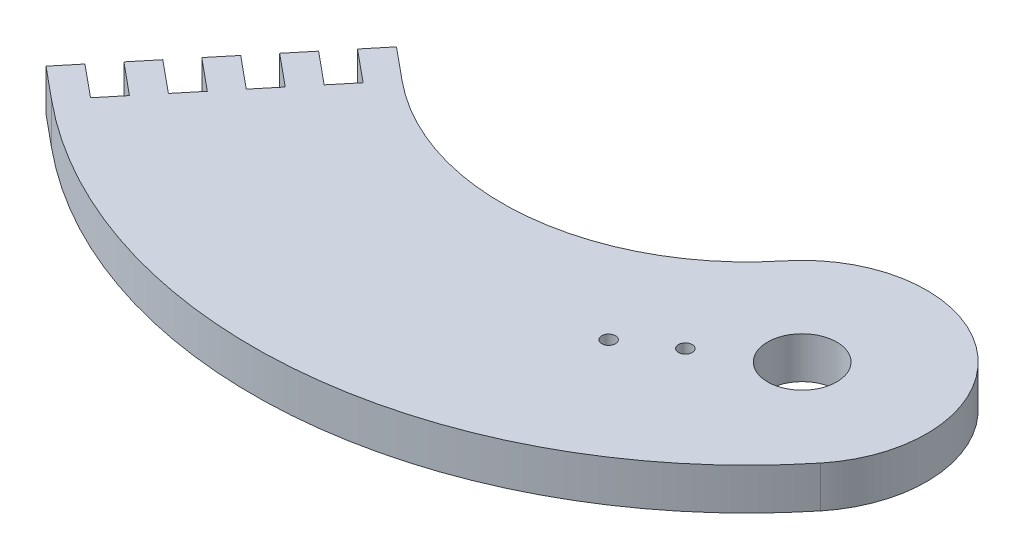
ISO-10303-21;
HEADER;
FILE_DESCRIPTION(('STEP AP214'),'2;1');
FILE_NAME('part.step','',(''),(''),'','','');
FILE_SCHEMA(('AUTOMOTIVE_DESIGN { 1 0 10303 214 1 1 1 1 }'));
ENDSEC;
DATA;
#1=APPLICATION_CONTEXT('core data for automotive mechanical design processes');
#2=APPLICATION_PROTOCOL_DEFINITION('international standard','automotive_design',2000,#1);
#3=PRODUCT_CONTEXT('',#1,'mechanical');
#4=PRODUCT('Part','Part','',(#3));
#5=PRODUCT_RELATED_PRODUCT_CATEGORY('part','',(#4));
#6=PRODUCT_DEFINITION_FORMATION('','',#4);
#7=PRODUCT_DEFINITION_CONTEXT('part definition',#1,'design');
#8=PRODUCT_DEFINITION('design','',#6,#7);
#9=PRODUCT_DEFINITION_SHAPE('','',#8);
#10=(LENGTH_UNIT() NAMED_UNIT(*) SI_UNIT(.MILLI.,.METRE.));
#11=(NAMED_UNIT(*) PLANE_ANGLE_UNIT() SI_UNIT($,.RADIAN.));
#12=(NAMED_UNIT(*) SI_UNIT($,.STERADIAN.) SOLID_ANGLE_UNIT());
#13=UNCERTAINTY_MEASURE_WITH_UNIT(LENGTH_MEASURE(1.E-05),#10,'distance_accuracy_value','');
#14=(GEOMETRIC_REPRESENTATION_CONTEXT(3) GLOBAL_UNCERTAINTY_ASSIGNED_CONTEXT((#13)) GLOBAL_UNIT_ASSIGNED_CONTEXT((#10,
#11,#12)) REPRESENTATION_CONTEXT('',''));
#15=CARTESIAN_POINT('',(0.,0.,0.));
#16=DIRECTION('',(0.,0.,1.));
#17=DIRECTION('',(1.,0.,0.));
#18=AXIS2_PLACEMENT_3D('',#15,#16,#17);
#19=CARTESIAN_POINT('',(-20.7827769161886,3.,-16.8415760441811));
#20=DIRECTION('',(0.,1.,0.));
#21=DIRECTION('',(0.,0.,1.));
#22=AXIS2_PLACEMENT_3D('',#19,#20,#21);
#23=PLANE('',#22);
#24=CARTESIAN_POINT('',(-5.06424038046005,3.,3.38253889392537));
#25=DIRECTION('',(0.,1.,0.));
#26=DIRECTION('',(0.,0.,1.));
#27=AXIS2_PLACEMENT_3D('',#24,#25,#26);
#28=CIRCLE('',#27,0.5);
#29=CARTESIAN_POINT('',(-5.06424038046005,3.,3.88253889392537));
#30=VERTEX_POINT('',#29);
#31=EDGE_CURVE('E416',#30,#30,#28,.T.);
#32=ORIENTED_EDGE('',*,*,#31,.F.);
#33=EDGE_LOOP('',(#32));
#34=FACE_BOUND('',#33,.T.);
#35=CARTESIAN_POINT('',(-20.7827769161886,3.,-16.8415760441811));
#36=DIRECTION('',(0.,-1.,0.));
#37=DIRECTION('',(0.,0.,1.));
#38=AXIS2_PLACEMENT_3D('',#35,#36,#37);
#39=CIRCLE('',#38,17.75);
#40=CARTESIAN_POINT('',(-6.99233615871768,3.,-5.6663246503787));
#41=VERTEX_POINT('',#40);
#42=CARTESIAN_POINT('',(-32.0851133337839,3.,-3.15509762555566));
#43=VERTEX_POINT('',#42);
#44=EDGE_CURVE('E256',#41,#43,#39,.T.);
#45=ORIENTED_EDGE('',*,*,#44,.T.);
#46=DIRECTION('',(-0.771069206683126,0.,-0.636751347470152));
#47=VECTOR('',#46,1.);
#48=CARTESIAN_POINT('',(-34.3983209538332,3.,-5.06535166796612));
#49=LINE('',#48,#47);
#50=CARTESIAN_POINT('',(-34.3983209538332,3.,-5.06535166796612));
#51=VERTEX_POINT('',#50);
#52=EDGE_CURVE('E134',#43,#51,#49,.T.);
#53=ORIENTED_EDGE('',*,*,#52,.T.);
#54=DIRECTION('',(-0.636751347470154,0.,0.771069206683124));
#55=VECTOR('',#54,1.);
#56=CARTESIAN_POINT('',(-34.3983209538332,3.,-5.06535166796612));
#57=LINE('',#56,#55);
#58=CARTESIAN_POINT('',(-35.6718236487735,3.,-3.52321325459987));
#59=VERTEX_POINT('',#58);
#60=EDGE_CURVE('E313',#51,#59,#57,.T.);
#61=ORIENTED_EDGE('',*,*,#60,.T.);
#62=DIRECTION('',(0.771069206683126,0.,0.636751347470153));
#63=VECTOR('',#62,1.);
#64=CARTESIAN_POINT('',(-35.6718236487735,3.,-3.52321325459987));
#65=LINE('',#64,#63);
#66=CARTESIAN_POINT('',(-33.3586160287242,3.,-1.61295921218941));
#67=VERTEX_POINT('',#66);
#68=EDGE_CURVE('E332',#59,#67,#65,.T.);
#69=ORIENTED_EDGE('',*,*,#68,.T.);
#70=DIRECTION('',(-0.636751347470151,0.,0.771069206683127));
#71=VECTOR('',#70,1.);
#72=CARTESIAN_POINT('',(-33.3586160287242,3.,-1.61295921218941));
#73=LINE('',#72,#71);
#74=CARTESIAN_POINT('',(-34.6321187236645,3.,-0.070820798823157));
#75=VERTEX_POINT('',#74);
#76=EDGE_CURVE('E329',#67,#75,#73,.T.);
#77=ORIENTED_EDGE('',*,*,#76,.T.);
#78=DIRECTION('',(-0.771069206683125,0.,-0.636751347470153));
#79=VECTOR('',#78,1.);
#80=CARTESIAN_POINT('',(-36.9453263437139,3.,-1.98107484123362));
#81=LINE('',#80,#79);
#82=CARTESIAN_POINT('',(-36.9453263437139,3.,-1.98107484123362));
#83=VERTEX_POINT('',#82);
#84=EDGE_CURVE('E331',#75,#83,#81,.T.);
#85=ORIENTED_EDGE('',*,*,#84,.T.);
#86=DIRECTION('',(-0.636751347470154,0.,0.771069206683124));
#87=VECTOR('',#86,1.);
#88=CARTESIAN_POINT('',(-36.9453263437139,3.,-1.98107484123362));
#89=LINE('',#88,#87);
#90=CARTESIAN_POINT('',(-38.2188290386542,3.,-0.438936427867368));
#91=VERTEX_POINT('',#90);
#92=EDGE_CURVE('E334',#83,#91,#89,.T.);
#93=ORIENTED_EDGE('',*,*,#92,.T.);
#94=DIRECTION('',(0.771069206683126,0.,0.636751347470152));
#95=VECTOR('',#94,1.);
#96=CARTESIAN_POINT('',(-38.2188290386542,3.,-0.438936427867368));
#97=LINE('',#96,#95);
#98=CARTESIAN_POINT('',(-35.9056214186048,3.,1.47131761454309));
#99=VERTEX_POINT('',#98);
#100=EDGE_CURVE('E340',#91,#99,#97,.T.);
#101=ORIENTED_EDGE('',*,*,#100,.T.);
#102=DIRECTION('',(-0.636751347470152,0.,0.771069206683126));
#103=VECTOR('',#102,1.);
#104=CARTESIAN_POINT('',(-35.9056214186048,3.,1.47131761454309));
#105=LINE('',#104,#103);
#106=CARTESIAN_POINT('',(-37.1791241135451,3.,3.01345602790934));
#107=VERTEX_POINT('',#106);
#108=EDGE_CURVE('E342',#99,#107,#105,.T.);
#109=ORIENTED_EDGE('',*,*,#108,.T.);
#110=DIRECTION('',(-0.771069206683126,0.,-0.636751347470152));
#111=VECTOR('',#110,1.);
#112=CARTESIAN_POINT('',(-39.4923317335945,3.,1.10320198549888));
#113=LINE('',#112,#111);
#114=CARTESIAN_POINT('',(-39.4923317335945,3.,1.10320198549888));
#115=VERTEX_POINT('',#114);
#116=EDGE_CURVE('E344',#107,#115,#113,.T.);
#117=ORIENTED_EDGE('',*,*,#116,.T.);
#118=DIRECTION('',(-0.636751347470154,0.,0.771069206683124));
#119=VECTOR('',#118,1.);
#120=CARTESIAN_POINT('',(-39.4923317335945,3.,1.10320198549888));
#121=LINE('',#120,#119);
#122=CARTESIAN_POINT('',(-40.7658344285348,3.,2.64534039886513));
#123=VERTEX_POINT('',#122);
#124=EDGE_CURVE('E346',#115,#123,#121,.T.);
#125=ORIENTED_EDGE('',*,*,#124,.T.);
#126=DIRECTION('',(0.771069206683126,0.,0.636751347470152));
#127=VECTOR('',#126,1.);
#128=CARTESIAN_POINT('',(-40.7658344285348,3.,2.64534039886513));
#129=LINE('',#128,#127);
#130=CARTESIAN_POINT('',(-38.4526268084854,3.,4.55559444127559));
#131=VERTEX_POINT('',#130);
#132=EDGE_CURVE('E348',#123,#131,#129,.T.);
#133=ORIENTED_EDGE('',*,*,#132,.T.);
#134=DIRECTION('',(-0.636751347470152,0.,0.771069206683126));
#135=VECTOR('',#134,1.);
#136=CARTESIAN_POINT('',(-38.4526268084854,3.,4.55559444127559));
#137=LINE('',#136,#135);
#138=CARTESIAN_POINT('',(-39.7261295034257,3.,6.09773285464184));
#139=VERTEX_POINT('',#138);
#140=EDGE_CURVE('E350',#131,#139,#137,.T.);
#141=ORIENTED_EDGE('',*,*,#140,.T.);
#142=DIRECTION('',(-0.771069206683126,0.,-0.636751347470152));
#143=VECTOR('',#142,1.);
#144=CARTESIAN_POINT('',(-42.0393371234751,3.,4.18747881223138));
#145=LINE('',#144,#143);
#146=CARTESIAN_POINT('',(-42.0393371234751,3.,4.18747881223138));
#147=VERTEX_POINT('',#146);
#148=EDGE_CURVE('E352',#139,#147,#145,.T.);
#149=ORIENTED_EDGE('',*,*,#148,.T.);
#150=DIRECTION('',(-0.636751347470154,0.,0.771069206683124));
#151=VECTOR('',#150,1.);
#152=CARTESIAN_POINT('',(-42.0393371234751,3.,4.18747881223138));
#153=LINE('',#152,#151);
#154=CARTESIAN_POINT('',(-43.3128398184154,3.,5.72961722559763));
#155=VERTEX_POINT('',#154);
#156=EDGE_CURVE('E354',#147,#155,#153,.T.);
#157=ORIENTED_EDGE('',*,*,#156,.T.);
#158=DIRECTION('',(0.771069206683126,0.,0.636751347470152));
#159=VECTOR('',#158,1.);
#160=CARTESIAN_POINT('',(-43.3128398184154,3.,5.72961722559763));
#161=LINE('',#160,#159);
#162=CARTESIAN_POINT('',(-40.999632198366,3.,7.63987126800809));
#163=VERTEX_POINT('',#162);
#164=EDGE_CURVE('E356',#155,#163,#161,.T.);
#165=ORIENTED_EDGE('',*,*,#164,.T.);
#166=DIRECTION('',(-0.636751347470147,0.,0.771069206683131));
#167=VECTOR('',#166,1.);
#168=CARTESIAN_POINT('',(-40.999632198366,3.,7.63987126800809));
#169=LINE('',#168,#167);
#170=CARTESIAN_POINT('',(-42.2731348933063,3.,9.18200968137435));
#171=VERTEX_POINT('',#170);
#172=EDGE_CURVE('E358',#163,#171,#169,.T.);
#173=ORIENTED_EDGE('',*,*,#172,.T.);
#174=DIRECTION('',(-0.771069206683126,0.,-0.636751347470153));
#175=VECTOR('',#174,1.);
#176=CARTESIAN_POINT('',(-44.5863425133557,3.,7.27175563896388));
#177=LINE('',#176,#175);
#178=CARTESIAN_POINT('',(-44.5863425133557,3.,7.27175563896388));
#179=VERTEX_POINT('',#178);
#180=EDGE_CURVE('E360',#171,#179,#177,.T.);
#181=ORIENTED_EDGE('',*,*,#180,.T.);
#182=DIRECTION('',(-0.636751347470145,0.,0.771069206683133));
#183=VECTOR('',#182,1.);
#184=CARTESIAN_POINT('',(-44.5863425133557,3.,7.27175563896388));
#185=LINE('',#184,#183);
#186=CARTESIAN_POINT('',(-45.859845208296,3.,8.81389405233015));
#187=VERTEX_POINT('',#186);
#188=EDGE_CURVE('E195',#179,#187,#185,.T.);
#189=ORIENTED_EDGE('',*,*,#188,.T.);
#190=DIRECTION('',(0.771069206683126,0.,0.636751347470152));
#191=VECTOR('',#190,1.);
#192=CARTESIAN_POINT('',(-45.859845208296,3.,8.81389405233015));
#193=LINE('',#192,#191);
#194=CARTESIAN_POINT('',(-43.5466375882466,3.,10.7241480947406));
#195=VERTEX_POINT('',#194);
#196=EDGE_CURVE('E189',#187,#195,#193,.T.);
#197=ORIENTED_EDGE('',*,*,#196,.T.);
#198=CARTESIAN_POINT('',(-20.7827769161886,3.,-16.8415760441811));
#199=DIRECTION('',(0.,1.,0.));
#200=DIRECTION('',(0.,0.,1.));
#201=AXIS2_PLACEMENT_3D('',#198,#199,#200);
#202=CIRCLE('',#201,35.75);
#203=CARTESIAN_POINT('',(6.99233615871769,3.,5.6663246503787));
#204=VERTEX_POINT('',#203);
#205=EDGE_CURVE('E193',#195,#204,#202,.T.);
#206=ORIENTED_EDGE('',*,*,#205,.T.);
#207=CARTESIAN_POINT('',(0.,3.,0.));
#208=DIRECTION('',(0.,1.,0.));
#209=DIRECTION('',(0.,0.,1.));
#210=AXIS2_PLACEMENT_3D('',#207,#208,#209);
#211=CIRCLE('',#210,9.);
#212=EDGE_CURVE('E49',#204,#41,#211,.T.);
#213=ORIENTED_EDGE('',*,*,#212,.T.);
#214=EDGE_LOOP('',(#45,#53,#61,#69,#77,#85,#93,#101,#109,#117,#125,#133,#141,#149,#157,#165,
#173,#181,#189,#197,#206,#213));
#215=FACE_BOUND('',#214,.T.);
#216=CARTESIAN_POINT('',(0.,3.,0.));
#217=DIRECTION('',(0.,1.,0.));
#218=DIRECTION('',(0.,0.,1.));
#219=AXIS2_PLACEMENT_3D('',#216,#217,#218);
#220=CIRCLE('',#219,2.5);
#221=CARTESIAN_POINT('',(0.,3.,2.5));
#222=VERTEX_POINT('',#221);
#223=EDGE_CURVE('E217',#222,#222,#220,.T.);
#224=ORIENTED_EDGE('',*,*,#223,.F.);
#225=EDGE_LOOP('',(#224));
#226=FACE_BOUND('',#225,.T.);
#227=CARTESIAN_POINT('',(-8.39050664020392,3.,5.60423931686486));
#228=DIRECTION('',(0.,1.,0.));
#229=DIRECTION('',(0.,0.,1.));
#230=AXIS2_PLACEMENT_3D('',#227,#228,#229);
#231=CIRCLE('',#230,0.500000000000001);
#232=CARTESIAN_POINT('',(-8.39050664020392,3.,6.10423931686486));
#233=VERTEX_POINT('',#232);
#234=EDGE_CURVE('E407',#233,#233,#231,.T.);
#235=ORIENTED_EDGE('',*,*,#234,.F.);
#236=EDGE_LOOP('',(#235));
#237=FACE_BOUND('',#236,.T.);
#238=ADVANCED_FACE('F32',(#34,#215,#226,#237),#23,.T.);
#239=CARTESIAN_POINT('',(-20.7827769161886,0.,-16.8415760441811));
#240=DIRECTION('',(0.,1.,0.));
#241=DIRECTION('',(0.,0.,1.));
#242=AXIS2_PLACEMENT_3D('',#239,#240,#241);
#243=PLANE('',#242);
#244=CARTESIAN_POINT('',(-5.06424038046005,0.,3.38253889392537));
#245=DIRECTION('',(0.,1.,0.));
#246=DIRECTION('',(0.,0.,1.));
#247=AXIS2_PLACEMENT_3D('',#244,#245,#246);
#248=CIRCLE('',#247,0.5);
#249=CARTESIAN_POINT('',(-5.06424038046005,0.,3.88253889392537));
#250=VERTEX_POINT('',#249);
#251=EDGE_CURVE('E413',#250,#250,#248,.T.);
#252=ORIENTED_EDGE('',*,*,#251,.T.);
#253=EDGE_LOOP('',(#252));
#254=FACE_BOUND('',#253,.T.);
#255=CARTESIAN_POINT('',(-20.7827769161886,0.,-16.8415760441811));
#256=DIRECTION('',(0.,-1.,0.));
#257=DIRECTION('',(0.,0.,1.));
#258=AXIS2_PLACEMENT_3D('',#255,#256,#257);
#259=CIRCLE('',#258,17.75);
#260=CARTESIAN_POINT('',(-6.99233615871768,0.,-5.6663246503787));
#261=VERTEX_POINT('',#260);
#262=CARTESIAN_POINT('',(-32.0851133337839,0.,-3.15509762555566));
#263=VERTEX_POINT('',#262);
#264=EDGE_CURVE('E213',#261,#263,#259,.T.);
#265=ORIENTED_EDGE('',*,*,#264,.F.);
#266=CARTESIAN_POINT('',(0.,0.,0.));
#267=DIRECTION('',(0.,1.,0.));
#268=DIRECTION('',(0.,0.,1.));
#269=AXIS2_PLACEMENT_3D('',#266,#267,#268);
#270=CIRCLE('',#269,9.);
#271=CARTESIAN_POINT('',(6.99233615871769,0.,5.6663246503787));
#272=VERTEX_POINT('',#271);
#273=EDGE_CURVE('E126',#272,#261,#270,.T.);
#274=ORIENTED_EDGE('',*,*,#273,.F.);
#275=CARTESIAN_POINT('',(-20.7827769161886,0.,-16.8415760441811));
#276=DIRECTION('',(0.,1.,0.));
#277=DIRECTION('',(0.,0.,1.));
#278=AXIS2_PLACEMENT_3D('',#275,#276,#277);
#279=CIRCLE('',#278,35.75);
#280=CARTESIAN_POINT('',(-43.5466375882466,0.,10.7241480947406));
#281=VERTEX_POINT('',#280);
#282=EDGE_CURVE('E120',#281,#272,#279,.T.);
#283=ORIENTED_EDGE('',*,*,#282,.F.);
#284=DIRECTION('',(0.771069206683126,0.,0.636751347470152));
#285=VECTOR('',#284,1.);
#286=CARTESIAN_POINT('',(-45.859845208296,0.,8.81389405233015));
#287=LINE('',#286,#285);
#288=CARTESIAN_POINT('',(-45.859845208296,0.,8.81389405233015));
#289=VERTEX_POINT('',#288);
#290=EDGE_CURVE('E203',#289,#281,#287,.T.);
#291=ORIENTED_EDGE('',*,*,#290,.F.);
#292=DIRECTION('',(-0.636751347470145,0.,0.771069206683133));
#293=VECTOR('',#292,1.);
#294=CARTESIAN_POINT('',(-44.5863425133557,0.,7.27175563896388));
#295=LINE('',#294,#293);
#296=CARTESIAN_POINT('',(-44.5863425133557,0.,7.27175563896388));
#297=VERTEX_POINT('',#296);
#298=EDGE_CURVE('E251',#297,#289,#295,.T.);
#299=ORIENTED_EDGE('',*,*,#298,.F.);
#300=DIRECTION('',(-0.771069206683126,0.,-0.636751347470153));
#301=VECTOR('',#300,1.);
#302=CARTESIAN_POINT('',(-44.5863425133557,0.,7.27175563896388));
#303=LINE('',#302,#301);
#304=CARTESIAN_POINT('',(-42.2731348933063,0.,9.18200968137435));
#305=VERTEX_POINT('',#304);
#306=EDGE_CURVE('E249',#305,#297,#303,.T.);
#307=ORIENTED_EDGE('',*,*,#306,.F.);
#308=DIRECTION('',(-0.636751347470147,0.,0.771069206683131));
#309=VECTOR('',#308,1.);
#310=CARTESIAN_POINT('',(-40.999632198366,0.,7.63987126800809));
#311=LINE('',#310,#309);
#312=CARTESIAN_POINT('',(-40.999632198366,0.,7.63987126800809));
#313=VERTEX_POINT('',#312);
#314=EDGE_CURVE('E247',#313,#305,#311,.T.);
#315=ORIENTED_EDGE('',*,*,#314,.F.);
#316=DIRECTION('',(0.771069206683126,0.,0.636751347470152));
#317=VECTOR('',#316,1.);
#318=CARTESIAN_POINT('',(-43.3128398184154,0.,5.72961722559763));
#319=LINE('',#318,#317);
#320=CARTESIAN_POINT('',(-43.3128398184154,0.,5.72961722559763));
#321=VERTEX_POINT('',#320);
#322=EDGE_CURVE('E245',#321,#313,#319,.T.);
#323=ORIENTED_EDGE('',*,*,#322,.F.);
#324=DIRECTION('',(-0.636751347470154,0.,0.771069206683124));
#325=VECTOR('',#324,1.);
#326=CARTESIAN_POINT('',(-42.0393371234751,0.,4.18747881223138));
#327=LINE('',#326,#325);
#328=CARTESIAN_POINT('',(-42.0393371234751,0.,4.18747881223138));
#329=VERTEX_POINT('',#328);
#330=EDGE_CURVE('E243',#329,#321,#327,.T.);
#331=ORIENTED_EDGE('',*,*,#330,.F.);
#332=DIRECTION('',(-0.771069206683126,0.,-0.636751347470152));
#333=VECTOR('',#332,1.);
#334=CARTESIAN_POINT('',(-42.0393371234751,0.,4.18747881223138));
#335=LINE('',#334,#333);
#336=CARTESIAN_POINT('',(-39.7261295034257,0.,6.09773285464184));
#337=VERTEX_POINT('',#336);
#338=EDGE_CURVE('E241',#337,#329,#335,.T.);
#339=ORIENTED_EDGE('',*,*,#338,.F.);
#340=DIRECTION('',(-0.636751347470152,0.,0.771069206683126));
#341=VECTOR('',#340,1.);
#342=CARTESIAN_POINT('',(-38.4526268084854,0.,4.55559444127559));
#343=LINE('',#342,#341);
#344=CARTESIAN_POINT('',(-38.4526268084854,0.,4.55559444127559));
#345=VERTEX_POINT('',#344);
#346=EDGE_CURVE('E239',#345,#337,#343,.T.);
#347=ORIENTED_EDGE('',*,*,#346,.F.);
#348=DIRECTION('',(0.771069206683126,0.,0.636751347470152));
#349=VECTOR('',#348,1.);
#350=CARTESIAN_POINT('',(-40.7658344285348,0.,2.64534039886513));
#351=LINE('',#350,#349);
#352=CARTESIAN_POINT('',(-40.7658344285348,0.,2.64534039886513));
#353=VERTEX_POINT('',#352);
#354=EDGE_CURVE('E237',#353,#345,#351,.T.);
#355=ORIENTED_EDGE('',*,*,#354,.F.);
#356=DIRECTION('',(-0.636751347470154,0.,0.771069206683124));
#357=VECTOR('',#356,1.);
#358=CARTESIAN_POINT('',(-39.4923317335945,0.,1.10320198549888));
#359=LINE('',#358,#357);
#360=CARTESIAN_POINT('',(-39.4923317335945,0.,1.10320198549888));
#361=VERTEX_POINT('',#360);
#362=EDGE_CURVE('E235',#361,#353,#359,.T.);
#363=ORIENTED_EDGE('',*,*,#362,.F.);
#364=DIRECTION('',(-0.771069206683126,0.,-0.636751347470152));
#365=VECTOR('',#364,1.);
#366=CARTESIAN_POINT('',(-39.4923317335945,0.,1.10320198549888));
#367=LINE('',#366,#365);
#368=CARTESIAN_POINT('',(-37.1791241135451,0.,3.01345602790934));
#369=VERTEX_POINT('',#368);
#370=EDGE_CURVE('E233',#369,#361,#367,.T.);
#371=ORIENTED_EDGE('',*,*,#370,.F.);
#372=DIRECTION('',(-0.636751347470152,0.,0.771069206683126));
#373=VECTOR('',#372,1.);
#374=CARTESIAN_POINT('',(-35.9056214186048,0.,1.47131761454309));
#375=LINE('',#374,#373);
#376=CARTESIAN_POINT('',(-35.9056214186048,0.,1.47131761454309));
#377=VERTEX_POINT('',#376);
#378=EDGE_CURVE('E231',#377,#369,#375,.T.);
#379=ORIENTED_EDGE('',*,*,#378,.F.);
#380=DIRECTION('',(0.771069206683126,0.,0.636751347470152));
#381=VECTOR('',#380,1.);
#382=CARTESIAN_POINT('',(-38.2188290386542,0.,-0.438936427867368));
#383=LINE('',#382,#381);
#384=CARTESIAN_POINT('',(-38.2188290386542,0.,-0.438936427867368));
#385=VERTEX_POINT('',#384);
#386=EDGE_CURVE('E229',#385,#377,#383,.T.);
#387=ORIENTED_EDGE('',*,*,#386,.F.);
#388=DIRECTION('',(-0.636751347470154,0.,0.771069206683124));
#389=VECTOR('',#388,1.);
#390=CARTESIAN_POINT('',(-36.9453263437139,0.,-1.98107484123362));
#391=LINE('',#390,#389);
#392=CARTESIAN_POINT('',(-36.9453263437139,0.,-1.98107484123362));
#393=VERTEX_POINT('',#392);
#394=EDGE_CURVE('E227',#393,#385,#391,.T.);
#395=ORIENTED_EDGE('',*,*,#394,.F.);
#396=DIRECTION('',(-0.771069206683125,0.,-0.636751347470153));
#397=VECTOR('',#396,1.);
#398=CARTESIAN_POINT('',(-36.9453263437139,0.,-1.98107484123362));
#399=LINE('',#398,#397);
#400=CARTESIAN_POINT('',(-34.6321187236645,0.,-0.070820798823157));
#401=VERTEX_POINT('',#400);
#402=EDGE_CURVE('E225',#401,#393,#399,.T.);
#403=ORIENTED_EDGE('',*,*,#402,.F.);
#404=DIRECTION('',(-0.636751347470151,0.,0.771069206683127));
#405=VECTOR('',#404,1.);
#406=CARTESIAN_POINT('',(-33.3586160287242,0.,-1.61295921218941));
#407=LINE('',#406,#405);
#408=CARTESIAN_POINT('',(-33.3586160287242,0.,-1.61295921218941));
#409=VERTEX_POINT('',#408);
#410=EDGE_CURVE('E223',#409,#401,#407,.T.);
#411=ORIENTED_EDGE('',*,*,#410,.F.);
#412=DIRECTION('',(0.771069206683126,0.,0.636751347470153));
#413=VECTOR('',#412,1.);
#414=CARTESIAN_POINT('',(-35.6718236487735,0.,-3.52321325459987));
#415=LINE('',#414,#413);
#416=CARTESIAN_POINT('',(-35.6718236487735,0.,-3.52321325459987));
#417=VERTEX_POINT('',#416);
#418=EDGE_CURVE('E221',#417,#409,#415,.T.);
#419=ORIENTED_EDGE('',*,*,#418,.F.);
#420=DIRECTION('',(-0.636751347470154,0.,0.771069206683124));
#421=VECTOR('',#420,1.);
#422=CARTESIAN_POINT('',(-34.3983209538332,0.,-5.06535166796612));
#423=LINE('',#422,#421);
#424=CARTESIAN_POINT('',(-34.3983209538332,0.,-5.06535166796612));
#425=VERTEX_POINT('',#424);
#426=EDGE_CURVE('E219',#425,#417,#423,.T.);
#427=ORIENTED_EDGE('',*,*,#426,.F.);
#428=DIRECTION('',(-0.771069206683126,0.,-0.636751347470152));
#429=VECTOR('',#428,1.);
#430=CARTESIAN_POINT('',(-34.3983209538332,0.,-5.06535166796612));
#431=LINE('',#430,#429);
#432=EDGE_CURVE('E216',#263,#425,#431,.T.);
#433=ORIENTED_EDGE('',*,*,#432,.F.);
#434=EDGE_LOOP('',(#265,#274,#283,#291,#299,#307,#315,#323,#331,#339,#347,#355,#363,#371,#379,
#387,#395,#403,#411,#419,#427,#433));
#435=FACE_BOUND('',#434,.T.);
#436=CARTESIAN_POINT('',(0.,0.,0.));
#437=DIRECTION('',(0.,1.,0.));
#438=DIRECTION('',(0.,0.,1.));
#439=AXIS2_PLACEMENT_3D('',#436,#437,#438);
#440=CIRCLE('',#439,2.5);
#441=CARTESIAN_POINT('',(0.,0.,2.5));
#442=VERTEX_POINT('',#441);
#443=EDGE_CURVE('E419',#442,#442,#440,.T.);
#444=ORIENTED_EDGE('',*,*,#443,.T.);
#445=EDGE_LOOP('',(#444));
#446=FACE_BOUND('',#445,.T.);
#447=CARTESIAN_POINT('',(-8.39050664020392,0.,5.60423931686486));
#448=DIRECTION('',(0.,1.,0.));
#449=DIRECTION('',(0.,0.,1.));
#450=AXIS2_PLACEMENT_3D('',#447,#448,#449);
#451=CIRCLE('',#450,0.500000000000001);
#452=CARTESIAN_POINT('',(-8.39050664020392,0.,6.10423931686486));
#453=VERTEX_POINT('',#452);
#454=EDGE_CURVE('E410',#453,#453,#451,.T.);
#455=ORIENTED_EDGE('',*,*,#454,.T.);
#456=EDGE_LOOP('',(#455));
#457=FACE_BOUND('',#456,.T.);
#458=ADVANCED_FACE('F317',(#254,#435,#446,#457),#243,.F.);
#459=CARTESIAN_POINT('',(-20.7827769161886,3.,-16.8415760441811));
#460=DIRECTION('',(0.,-1.,0.));
#461=DIRECTION('',(0.,0.,-1.));
#462=AXIS2_PLACEMENT_3D('',#459,#460,#461);
#463=CYLINDRICAL_SURFACE('',#462,17.75);
#464=ORIENTED_EDGE('',*,*,#264,.T.);
#465=DIRECTION('',(0.,-1.,0.));
#466=VECTOR('',#465,1.);
#467=CARTESIAN_POINT('',(-32.0851133337839,3.,-3.15509762555566));
#468=LINE('',#467,#466);
#469=EDGE_CURVE('E11',#43,#263,#468,.T.);
#470=ORIENTED_EDGE('',*,*,#469,.F.);
#471=ORIENTED_EDGE('',*,*,#44,.F.);
#472=DIRECTION('',(0.,-1.,0.));
#473=VECTOR('',#472,1.);
#474=CARTESIAN_POINT('',(-6.99233615871768,3.,-5.6663246503787));
#475=LINE('',#474,#473);
#476=EDGE_CURVE('E209',#41,#261,#475,.T.);
#477=ORIENTED_EDGE('',*,*,#476,.T.);
#478=EDGE_LOOP('',(#464,#470,#471,#477));
#479=FACE_BOUND('',#478,.T.);
#480=ADVANCED_FACE('F34',(#479),#463,.F.);
#481=CARTESIAN_POINT('',(-34.3983209538332,3.,-5.06535166796612));
#482=DIRECTION('',(-0.636751347470152,0.,0.771069206683126));
#483=DIRECTION('',(0.771069206683126,0.,0.636751347470152));
#484=AXIS2_PLACEMENT_3D('',#481,#482,#483);
#485=PLANE('',#484);
#486=ORIENTED_EDGE('',*,*,#432,.T.);
#487=DIRECTION('',(0.,-1.,0.));
#488=VECTOR('',#487,1.);
#489=CARTESIAN_POINT('',(-34.3983209538332,3.,-5.06535166796612));
#490=LINE('',#489,#488);
#491=EDGE_CURVE('E41',#51,#425,#490,.T.);
#492=ORIENTED_EDGE('',*,*,#491,.F.);
#493=ORIENTED_EDGE('',*,*,#52,.F.);
#494=ORIENTED_EDGE('',*,*,#469,.T.);
#495=EDGE_LOOP('',(#486,#492,#493,#494));
#496=FACE_BOUND('',#495,.T.);
#497=ADVANCED_FACE('F620',(#496),#485,.F.);
#498=CARTESIAN_POINT('',(-34.3983209538332,3.,-5.06535166796612));
#499=DIRECTION('',(0.771069206683124,0.,0.636751347470154));
#500=DIRECTION('',(0.636751347470154,0.,-0.771069206683125));
#501=AXIS2_PLACEMENT_3D('',#498,#499,#500);
#502=PLANE('',#501);
#503=ORIENTED_EDGE('',*,*,#426,.T.);
#504=DIRECTION('',(0.,-1.,0.));
#505=VECTOR('',#504,1.);
#506=CARTESIAN_POINT('',(-35.6718236487735,3.,-3.52321325459987));
#507=LINE('',#506,#505);
#508=EDGE_CURVE('E305',#59,#417,#507,.T.);
#509=ORIENTED_EDGE('',*,*,#508,.F.);
#510=ORIENTED_EDGE('',*,*,#60,.F.);
#511=ORIENTED_EDGE('',*,*,#491,.T.);
#512=EDGE_LOOP('',(#503,#509,#510,#511));
#513=FACE_BOUND('',#512,.T.);
#514=ADVANCED_FACE('F311',(#513),#502,.F.);
#515=CARTESIAN_POINT('',(-35.6718236487735,3.,-3.52321325459987));
#516=DIRECTION('',(0.636751347470153,0.,-0.771069206683126));
#517=DIRECTION('',(-0.771069206683126,0.,-0.636751347470153));
#518=AXIS2_PLACEMENT_3D('',#515,#516,#517);
#519=PLANE('',#518);
#520=ORIENTED_EDGE('',*,*,#418,.T.);
#521=DIRECTION('',(0.,-1.,0.));
#522=VECTOR('',#521,1.);
#523=CARTESIAN_POINT('',(-33.3586160287242,3.,-1.61295921218941));
#524=LINE('',#523,#522);
#525=EDGE_CURVE('E302',#67,#409,#524,.T.);
#526=ORIENTED_EDGE('',*,*,#525,.F.);
#527=ORIENTED_EDGE('',*,*,#68,.F.);
#528=ORIENTED_EDGE('',*,*,#508,.T.);
#529=EDGE_LOOP('',(#520,#526,#527,#528));
#530=FACE_BOUND('',#529,.T.);
#531=ADVANCED_FACE('F323',(#530),#519,.F.);
#532=CARTESIAN_POINT('',(-33.3586160287242,3.,-1.61295921218941));
#533=DIRECTION('',(0.771069206683127,0.,0.636751347470151));
#534=DIRECTION('',(0.636751347470151,0.,-0.771069206683127));
#535=AXIS2_PLACEMENT_3D('',#532,#533,#534);
#536=PLANE('',#535);
#537=ORIENTED_EDGE('',*,*,#410,.T.);
#538=DIRECTION('',(0.,-1.,0.));
#539=VECTOR('',#538,1.);
#540=CARTESIAN_POINT('',(-34.6321187236645,3.,-0.070820798823157));
#541=LINE('',#540,#539);
#542=EDGE_CURVE('E299',#75,#401,#541,.T.);
#543=ORIENTED_EDGE('',*,*,#542,.F.);
#544=ORIENTED_EDGE('',*,*,#76,.F.);
#545=ORIENTED_EDGE('',*,*,#525,.T.);
#546=EDGE_LOOP('',(#537,#543,#544,#545));
#547=FACE_BOUND('',#546,.T.);
#548=ADVANCED_FACE('F327',(#547),#536,.F.);
#549=CARTESIAN_POINT('',(-36.9453263437139,3.,-1.98107484123362));
#550=DIRECTION('',(-0.636751347470153,0.,0.771069206683125));
#551=DIRECTION('',(0.771069206683125,0.,0.636751347470153));
#552=AXIS2_PLACEMENT_3D('',#549,#550,#551);
#553=PLANE('',#552);
#554=ORIENTED_EDGE('',*,*,#402,.T.);
#555=DIRECTION('',(0.,-1.,0.));
#556=VECTOR('',#555,1.);
#557=CARTESIAN_POINT('',(-36.9453263437139,3.,-1.98107484123362));
#558=LINE('',#557,#556);
#559=EDGE_CURVE('E296',#83,#393,#558,.T.);
#560=ORIENTED_EDGE('',*,*,#559,.F.);
#561=ORIENTED_EDGE('',*,*,#84,.F.);
#562=ORIENTED_EDGE('',*,*,#542,.T.);
#563=EDGE_LOOP('',(#554,#560,#561,#562));
#564=FACE_BOUND('',#563,.T.);
#565=ADVANCED_FACE('F585',(#564),#553,.F.);
#566=CARTESIAN_POINT('',(-36.9453263437139,3.,-1.98107484123362));
#567=DIRECTION('',(0.771069206683124,0.,0.636751347470154));
#568=DIRECTION('',(0.636751347470154,0.,-0.771069206683124));
#569=AXIS2_PLACEMENT_3D('',#566,#567,#568);
#570=PLANE('',#569);
#571=ORIENTED_EDGE('',*,*,#394,.T.);
#572=DIRECTION('',(0.,-1.,0.));
#573=VECTOR('',#572,1.);
#574=CARTESIAN_POINT('',(-38.2188290386542,3.,-0.438936427867368));
#575=LINE('',#574,#573);
#576=EDGE_CURVE('E293',#91,#385,#575,.T.);
#577=ORIENTED_EDGE('',*,*,#576,.F.);
#578=ORIENTED_EDGE('',*,*,#92,.F.);
#579=ORIENTED_EDGE('',*,*,#559,.T.);
#580=EDGE_LOOP('',(#571,#577,#578,#579));
#581=FACE_BOUND('',#580,.T.);
#582=ADVANCED_FACE('F575',(#581),#570,.F.);
#583=CARTESIAN_POINT('',(-38.2188290386542,3.,-0.438936427867368));
#584=DIRECTION('',(0.636751347470152,0.,-0.771069206683126));
#585=DIRECTION('',(-0.771069206683126,0.,-0.636751347470152));
#586=AXIS2_PLACEMENT_3D('',#583,#584,#585);
#587=PLANE('',#586);
#588=ORIENTED_EDGE('',*,*,#386,.T.);
#589=DIRECTION('',(0.,-1.,0.));
#590=VECTOR('',#589,1.);
#591=CARTESIAN_POINT('',(-35.9056214186048,3.,1.47131761454309));
#592=LINE('',#591,#590);
#593=EDGE_CURVE('E290',#99,#377,#592,.T.);
#594=ORIENTED_EDGE('',*,*,#593,.F.);
#595=ORIENTED_EDGE('',*,*,#100,.F.);
#596=ORIENTED_EDGE('',*,*,#576,.T.);
#597=EDGE_LOOP('',(#588,#594,#595,#596));
#598=FACE_BOUND('',#597,.T.);
#599=ADVANCED_FACE('F565',(#598),#587,.F.);
#600=CARTESIAN_POINT('',(-35.9056214186048,3.,1.47131761454309));
#601=DIRECTION('',(0.771069206683126,0.,0.636751347470152));
#602=DIRECTION('',(0.636751347470152,0.,-0.771069206683126));
#603=AXIS2_PLACEMENT_3D('',#600,#601,#602);
#604=PLANE('',#603);
#605=ORIENTED_EDGE('',*,*,#378,.T.);
#606=DIRECTION('',(0.,-1.,0.));
#607=VECTOR('',#606,1.);
#608=CARTESIAN_POINT('',(-37.1791241135451,3.,3.01345602790934));
#609=LINE('',#608,#607);
#610=EDGE_CURVE('E287',#107,#369,#609,.T.);
#611=ORIENTED_EDGE('',*,*,#610,.F.);
#612=ORIENTED_EDGE('',*,*,#108,.F.);
#613=ORIENTED_EDGE('',*,*,#593,.T.);
#614=EDGE_LOOP('',(#605,#611,#612,#613));
#615=FACE_BOUND('',#614,.T.);
#616=ADVANCED_FACE('F555',(#615),#604,.F.);
#617=CARTESIAN_POINT('',(-39.4923317335945,3.,1.10320198549888));
#618=DIRECTION('',(-0.636751347470152,0.,0.771069206683126));
#619=DIRECTION('',(0.771069206683126,0.,0.636751347470152));
#620=AXIS2_PLACEMENT_3D('',#617,#618,#619);
#621=PLANE('',#620);
#622=ORIENTED_EDGE('',*,*,#370,.T.);
#623=DIRECTION('',(0.,-1.,0.));
#624=VECTOR('',#623,1.);
#625=CARTESIAN_POINT('',(-39.4923317335945,3.,1.10320198549888));
#626=LINE('',#625,#624);
#627=EDGE_CURVE('E284',#115,#361,#626,.T.);
#628=ORIENTED_EDGE('',*,*,#627,.F.);
#629=ORIENTED_EDGE('',*,*,#116,.F.);
#630=ORIENTED_EDGE('',*,*,#610,.T.);
#631=EDGE_LOOP('',(#622,#628,#629,#630));
#632=FACE_BOUND('',#631,.T.);
#633=ADVANCED_FACE('F545',(#632),#621,.F.);
#634=CARTESIAN_POINT('',(-39.4923317335945,3.,1.10320198549888));
#635=DIRECTION('',(0.771069206683124,0.,0.636751347470154));
#636=DIRECTION('',(0.636751347470154,0.,-0.771069206683125));
#637=AXIS2_PLACEMENT_3D('',#634,#635,#636);
#638=PLANE('',#637);
#639=ORIENTED_EDGE('',*,*,#362,.T.);
#640=DIRECTION('',(0.,-1.,0.));
#641=VECTOR('',#640,1.);
#642=CARTESIAN_POINT('',(-40.7658344285348,3.,2.64534039886513));
#643=LINE('',#642,#641);
#644=EDGE_CURVE('E281',#123,#353,#643,.T.);
#645=ORIENTED_EDGE('',*,*,#644,.F.);
#646=ORIENTED_EDGE('',*,*,#124,.F.);
#647=ORIENTED_EDGE('',*,*,#627,.T.);
#648=EDGE_LOOP('',(#639,#645,#646,#647));
#649=FACE_BOUND('',#648,.T.);
#650=ADVANCED_FACE('F535',(#649),#638,.F.);
#651=CARTESIAN_POINT('',(-40.7658344285348,3.,2.64534039886513));
#652=DIRECTION('',(0.636751347470152,0.,-0.771069206683126));
#653=DIRECTION('',(-0.771069206683126,0.,-0.636751347470152));
#654=AXIS2_PLACEMENT_3D('',#651,#652,#653);
#655=PLANE('',#654);
#656=ORIENTED_EDGE('',*,*,#354,.T.);
#657=DIRECTION('',(0.,-1.,0.));
#658=VECTOR('',#657,1.);
#659=CARTESIAN_POINT('',(-38.4526268084854,3.,4.55559444127559));
#660=LINE('',#659,#658);
#661=EDGE_CURVE('E278',#131,#345,#660,.T.);
#662=ORIENTED_EDGE('',*,*,#661,.F.);
#663=ORIENTED_EDGE('',*,*,#132,.F.);
#664=ORIENTED_EDGE('',*,*,#644,.T.);
#665=EDGE_LOOP('',(#656,#662,#663,#664));
#666=FACE_BOUND('',#665,.T.);
#667=ADVANCED_FACE('F525',(#666),#655,.F.);
#668=CARTESIAN_POINT('',(-38.4526268084854,3.,4.55559444127559));
#669=DIRECTION('',(0.771069206683126,0.,0.636751347470152));
#670=DIRECTION('',(0.636751347470152,0.,-0.771069206683126));
#671=AXIS2_PLACEMENT_3D('',#668,#669,#670);
#672=PLANE('',#671);
#673=ORIENTED_EDGE('',*,*,#346,.T.);
#674=DIRECTION('',(0.,-1.,0.));
#675=VECTOR('',#674,1.);
#676=CARTESIAN_POINT('',(-39.7261295034257,3.,6.09773285464184));
#677=LINE('',#676,#675);
#678=EDGE_CURVE('E275',#139,#337,#677,.T.);
#679=ORIENTED_EDGE('',*,*,#678,.F.);
#680=ORIENTED_EDGE('',*,*,#140,.F.);
#681=ORIENTED_EDGE('',*,*,#661,.T.);
#682=EDGE_LOOP('',(#673,#679,#680,#681));
#683=FACE_BOUND('',#682,.T.);
#684=ADVANCED_FACE('F515',(#683),#672,.F.);
#685=CARTESIAN_POINT('',(-42.0393371234751,3.,4.18747881223138));
#686=DIRECTION('',(-0.636751347470152,0.,0.771069206683126));
#687=DIRECTION('',(0.771069206683126,0.,0.636751347470152));
#688=AXIS2_PLACEMENT_3D('',#685,#686,#687);
#689=PLANE('',#688);
#690=ORIENTED_EDGE('',*,*,#338,.T.);
#691=DIRECTION('',(0.,-1.,0.));
#692=VECTOR('',#691,1.);
#693=CARTESIAN_POINT('',(-42.0393371234751,3.,4.18747881223138));
#694=LINE('',#693,#692);
#695=EDGE_CURVE('E272',#147,#329,#694,.T.);
#696=ORIENTED_EDGE('',*,*,#695,.F.);
#697=ORIENTED_EDGE('',*,*,#148,.F.);
#698=ORIENTED_EDGE('',*,*,#678,.T.);
#699=EDGE_LOOP('',(#690,#696,#697,#698));
#700=FACE_BOUND('',#699,.T.);
#701=ADVANCED_FACE('F505',(#700),#689,.F.);
#702=CARTESIAN_POINT('',(-42.0393371234751,3.,4.18747881223138));
#703=DIRECTION('',(0.771069206683124,0.,0.636751347470154));
#704=DIRECTION('',(0.636751347470154,0.,-0.771069206683125));
#705=AXIS2_PLACEMENT_3D('',#702,#703,#704);
#706=PLANE('',#705);
#707=ORIENTED_EDGE('',*,*,#330,.T.);
#708=DIRECTION('',(0.,-1.,0.));
#709=VECTOR('',#708,1.);
#710=CARTESIAN_POINT('',(-43.3128398184154,3.,5.72961722559763));
#711=LINE('',#710,#709);
#712=EDGE_CURVE('E269',#155,#321,#711,.T.);
#713=ORIENTED_EDGE('',*,*,#712,.F.);
#714=ORIENTED_EDGE('',*,*,#156,.F.);
#715=ORIENTED_EDGE('',*,*,#695,.T.);
#716=EDGE_LOOP('',(#707,#713,#714,#715));
#717=FACE_BOUND('',#716,.T.);
#718=ADVANCED_FACE('F495',(#717),#706,.F.);
#719=CARTESIAN_POINT('',(-43.3128398184154,3.,5.72961722559763));
#720=DIRECTION('',(0.636751347470152,0.,-0.771069206683126));
#721=DIRECTION('',(-0.771069206683126,0.,-0.636751347470152));
#722=AXIS2_PLACEMENT_3D('',#719,#720,#721);
#723=PLANE('',#722);
#724=ORIENTED_EDGE('',*,*,#322,.T.);
#725=DIRECTION('',(0.,-1.,0.));
#726=VECTOR('',#725,1.);
#727=CARTESIAN_POINT('',(-40.999632198366,3.,7.63987126800809));
#728=LINE('',#727,#726);
#729=EDGE_CURVE('E266',#163,#313,#728,.T.);
#730=ORIENTED_EDGE('',*,*,#729,.F.);
#731=ORIENTED_EDGE('',*,*,#164,.F.);
#732=ORIENTED_EDGE('',*,*,#712,.T.);
#733=EDGE_LOOP('',(#724,#730,#731,#732));
#734=FACE_BOUND('',#733,.T.);
#735=ADVANCED_FACE('F485',(#734),#723,.F.);
#736=CARTESIAN_POINT('',(-40.999632198366,3.,7.63987126800809));
#737=DIRECTION('',(0.771069206683131,0.,0.636751347470147));
#738=DIRECTION('',(0.636751347470147,0.,-0.771069206683131));
#739=AXIS2_PLACEMENT_3D('',#736,#737,#738);
#740=PLANE('',#739);
#741=ORIENTED_EDGE('',*,*,#314,.T.);
#742=DIRECTION('',(0.,-1.,0.));
#743=VECTOR('',#742,1.);
#744=CARTESIAN_POINT('',(-42.2731348933063,3.,9.18200968137435));
#745=LINE('',#744,#743);
#746=EDGE_CURVE('E263',#171,#305,#745,.T.);
#747=ORIENTED_EDGE('',*,*,#746,.F.);
#748=ORIENTED_EDGE('',*,*,#172,.F.);
#749=ORIENTED_EDGE('',*,*,#729,.T.);
#750=EDGE_LOOP('',(#741,#747,#748,#749));
#751=FACE_BOUND('',#750,.T.);
#752=ADVANCED_FACE('F476',(#751),#740,.F.);
#753=CARTESIAN_POINT('',(-44.5863425133557,3.,7.27175563896388));
#754=DIRECTION('',(-0.636751347470153,0.,0.771069206683125));
#755=DIRECTION('',(0.771069206683126,0.,0.636751347470153));
#756=AXIS2_PLACEMENT_3D('',#753,#754,#755);
#757=PLANE('',#756);
#758=ORIENTED_EDGE('',*,*,#306,.T.);
#759=DIRECTION('',(0.,-1.,0.));
#760=VECTOR('',#759,1.);
#761=CARTESIAN_POINT('',(-44.5863425133557,3.,7.27175563896388));
#762=LINE('',#761,#760);
#763=EDGE_CURVE('E260',#179,#297,#762,.T.);
#764=ORIENTED_EDGE('',*,*,#763,.F.);
#765=ORIENTED_EDGE('',*,*,#180,.F.);
#766=ORIENTED_EDGE('',*,*,#746,.T.);
#767=EDGE_LOOP('',(#758,#764,#765,#766));
#768=FACE_BOUND('',#767,.T.);
#769=ADVANCED_FACE('F366',(#768),#757,.F.);
#770=CARTESIAN_POINT('',(-44.5863425133557,3.,7.27175563896388));
#771=DIRECTION('',(0.771069206683133,0.,0.636751347470144));
#772=DIRECTION('',(0.636751347470144,0.,-0.771069206683133));
#773=AXIS2_PLACEMENT_3D('',#770,#771,#772);
#774=PLANE('',#773);
#775=ORIENTED_EDGE('',*,*,#298,.T.);
#776=DIRECTION('',(0.,-1.,0.));
#777=VECTOR('',#776,1.);
#778=CARTESIAN_POINT('',(-45.859845208296,3.,8.81389405233015));
#779=LINE('',#778,#777);
#780=EDGE_CURVE('E204',#187,#289,#779,.T.);
#781=ORIENTED_EDGE('',*,*,#780,.F.);
#782=ORIENTED_EDGE('',*,*,#188,.F.);
#783=ORIENTED_EDGE('',*,*,#763,.T.);
#784=EDGE_LOOP('',(#775,#781,#782,#783));
#785=FACE_BOUND('',#784,.T.);
#786=ADVANCED_FACE('F370',(#785),#774,.F.);
#787=CARTESIAN_POINT('',(-45.859845208296,3.,8.81389405233015));
#788=DIRECTION('',(0.636751347470152,0.,-0.771069206683126));
#789=DIRECTION('',(-0.771069206683126,0.,-0.636751347470152));
#790=AXIS2_PLACEMENT_3D('',#787,#788,#789);
#791=PLANE('',#790);
#792=ORIENTED_EDGE('',*,*,#290,.T.);
#793=DIRECTION('',(0.,-1.,0.));
#794=VECTOR('',#793,1.);
#795=CARTESIAN_POINT('',(-43.5466375882466,3.,10.7241480947406));
#796=LINE('',#795,#794);
#797=EDGE_CURVE('E200',#195,#281,#796,.T.);
#798=ORIENTED_EDGE('',*,*,#797,.F.);
#799=ORIENTED_EDGE('',*,*,#196,.F.);
#800=ORIENTED_EDGE('',*,*,#780,.T.);
#801=EDGE_LOOP('',(#792,#798,#799,#800));
#802=FACE_BOUND('',#801,.T.);
#803=ADVANCED_FACE('F201',(#802),#791,.F.);
#804=CARTESIAN_POINT('',(-20.7827769161886,3.,-16.8415760441811));
#805=DIRECTION('',(0.,-1.,0.));
#806=DIRECTION('',(0.,0.,-1.));
#807=AXIS2_PLACEMENT_3D('',#804,#805,#806);
#808=CYLINDRICAL_SURFACE('',#807,35.75);
#809=ORIENTED_EDGE('',*,*,#282,.T.);
#810=DIRECTION('',(0.,-1.,0.));
#811=VECTOR('',#810,1.);
#812=CARTESIAN_POINT('',(6.99233615871769,3.,5.6663246503787));
#813=LINE('',#812,#811);
#814=EDGE_CURVE('E205',#204,#272,#813,.T.);
#815=ORIENTED_EDGE('',*,*,#814,.F.);
#816=ORIENTED_EDGE('',*,*,#205,.F.);
#817=ORIENTED_EDGE('',*,*,#797,.T.);
#818=EDGE_LOOP('',(#809,#815,#816,#817));
#819=FACE_BOUND('',#818,.T.);
#820=ADVANCED_FACE('F207',(#819),#808,.T.);
#821=CARTESIAN_POINT('',(0.,3.,0.));
#822=DIRECTION('',(0.,-1.,0.));
#823=DIRECTION('',(0.,0.,-1.));
#824=AXIS2_PLACEMENT_3D('',#821,#822,#823);
#825=CYLINDRICAL_SURFACE('',#824,9.);
#826=ORIENTED_EDGE('',*,*,#273,.T.);
#827=ORIENTED_EDGE('',*,*,#476,.F.);
#828=ORIENTED_EDGE('',*,*,#212,.F.);
#829=ORIENTED_EDGE('',*,*,#814,.T.);
#830=EDGE_LOOP('',(#826,#827,#828,#829));
#831=FACE_BOUND('',#830,.T.);
#832=ADVANCED_FACE('F374',(#831),#825,.T.);
#833=CARTESIAN_POINT('',(0.,3.,0.));
#834=DIRECTION('',(0.,-1.,0.));
#835=DIRECTION('',(0.,0.,-1.));
#836=AXIS2_PLACEMENT_3D('',#833,#834,#835);
#837=CYLINDRICAL_SURFACE('',#836,2.5);
#838=ORIENTED_EDGE('',*,*,#223,.T.);
#839=EDGE_LOOP('',(#838));
#840=FACE_BOUND('',#839,.T.);
#841=ORIENTED_EDGE('',*,*,#443,.F.);
#842=EDGE_LOOP('',(#841));
#843=FACE_BOUND('',#842,.T.);
#844=ADVANCED_FACE('F376',(#840,#843),#837,.F.);
#845=CARTESIAN_POINT('',(-5.06424038046005,3.,3.38253889392537));
#846=DIRECTION('',(0.,-1.,0.));
#847=DIRECTION('',(0.,0.,-1.));
#848=AXIS2_PLACEMENT_3D('',#845,#846,#847);
#849=CYLINDRICAL_SURFACE('',#848,0.5);
#850=ORIENTED_EDGE('',*,*,#31,.T.);
#851=EDGE_LOOP('',(#850));
#852=FACE_BOUND('',#851,.T.);
#853=ORIENTED_EDGE('',*,*,#251,.F.);
#854=EDGE_LOOP('',(#853));
#855=FACE_BOUND('',#854,.T.);
#856=ADVANCED_FACE('F382',(#852,#855),#849,.F.);
#857=CARTESIAN_POINT('',(-8.39050664020392,3.,5.60423931686486));
#858=DIRECTION('',(0.,-1.,0.));
#859=DIRECTION('',(0.,0.,-1.));
#860=AXIS2_PLACEMENT_3D('',#857,#858,#859);
#861=CYLINDRICAL_SURFACE('',#860,0.500000000000001);
#862=ORIENTED_EDGE('',*,*,#234,.T.);
#863=EDGE_LOOP('',(#862));
#864=FACE_BOUND('',#863,.T.);
#865=ORIENTED_EDGE('',*,*,#454,.F.);
#866=EDGE_LOOP('',(#865));
#867=FACE_BOUND('',#866,.T.);
#868=ADVANCED_FACE('F398',(#864,#867),#861,.F.);
#869=CLOSED_SHELL('',(#238,#458,#480,#497,#514,#531,#548,#565,#582,#599,#616,#633,#650,#667,
#684,#701,#718,#735,#752,#769,#786,#803,#820,#832,#844,#856,#868));
#870=MANIFOLD_SOLID_BREP('B2',#869);
#871=ADVANCED_BREP_SHAPE_REPRESENTATION('',(#18,#870),#14);
#872=SHAPE_DEFINITION_REPRESENTATION(#9,#871);
ENDSEC;
END-ISO-10303-21;
